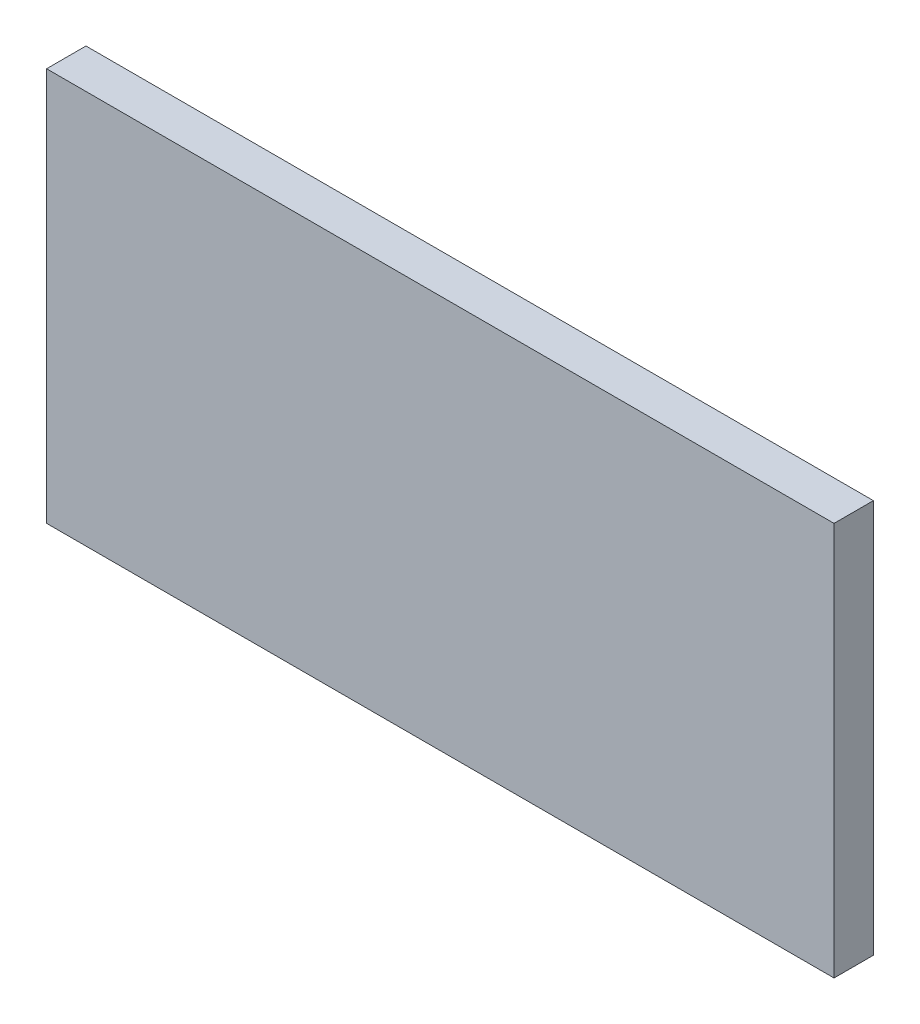
ISO-10303-21;
HEADER;
FILE_DESCRIPTION(('STEP AP214'),'2;1');
FILE_NAME('part.step','',(''),(''),'','','');
FILE_SCHEMA(('AUTOMOTIVE_DESIGN { 1 0 10303 214 1 1 1 1 }'));
ENDSEC;
DATA;
#1=APPLICATION_CONTEXT('core data for automotive mechanical design processes');
#2=APPLICATION_PROTOCOL_DEFINITION('international standard','automotive_design',2000,#1);
#3=PRODUCT_CONTEXT('',#1,'mechanical');
#4=PRODUCT('Part','Part','',(#3));
#5=PRODUCT_RELATED_PRODUCT_CATEGORY('part','',(#4));
#6=PRODUCT_DEFINITION_FORMATION('','',#4);
#7=PRODUCT_DEFINITION_CONTEXT('part definition',#1,'design');
#8=PRODUCT_DEFINITION('design','',#6,#7);
#9=PRODUCT_DEFINITION_SHAPE('','',#8);
#10=(LENGTH_UNIT() NAMED_UNIT(*) SI_UNIT(.MILLI.,.METRE.));
#11=(NAMED_UNIT(*) PLANE_ANGLE_UNIT() SI_UNIT($,.RADIAN.));
#12=(NAMED_UNIT(*) SI_UNIT($,.STERADIAN.) SOLID_ANGLE_UNIT());
#13=UNCERTAINTY_MEASURE_WITH_UNIT(LENGTH_MEASURE(1.E-05),#10,'distance_accuracy_value','');
#14=(GEOMETRIC_REPRESENTATION_CONTEXT(3) GLOBAL_UNCERTAINTY_ASSIGNED_CONTEXT((#13)) GLOBAL_UNIT_ASSIGNED_CONTEXT((#10,
#11,#12)) REPRESENTATION_CONTEXT('',''));
#15=CARTESIAN_POINT('',(0.,0.,0.));
#16=DIRECTION('',(0.,0.,1.));
#17=DIRECTION('',(1.,0.,0.));
#18=AXIS2_PLACEMENT_3D('',#15,#16,#17);
#19=CARTESIAN_POINT('',(0.,0.,2.54));
#20=DIRECTION('',(1.,0.,0.));
#21=DIRECTION('',(0.,0.,-1.));
#22=AXIS2_PLACEMENT_3D('',#19,#20,#21);
#23=PLANE('',#22);
#24=DIRECTION('',(0.,-1.,0.));
#25=VECTOR('',#24,1.);
#26=CARTESIAN_POINT('',(0.,0.,0.));
#27=LINE('',#26,#25);
#28=CARTESIAN_POINT('',(0.,25.4,0.));
#29=VERTEX_POINT('',#28);
#30=CARTESIAN_POINT('',(0.,0.,0.));
#31=VERTEX_POINT('',#30);
#32=EDGE_CURVE('E103',#29,#31,#27,.T.);
#33=ORIENTED_EDGE('',*,*,#32,.T.);
#34=DIRECTION('',(0.,0.,-1.));
#35=VECTOR('',#34,1.);
#36=CARTESIAN_POINT('',(0.,0.,2.54));
#37=LINE('',#36,#35);
#38=CARTESIAN_POINT('',(0.,0.,2.54));
#39=VERTEX_POINT('',#38);
#40=EDGE_CURVE('E11',#39,#31,#37,.T.);
#41=ORIENTED_EDGE('',*,*,#40,.F.);
#42=DIRECTION('',(0.,-1.,0.));
#43=VECTOR('',#42,1.);
#44=CARTESIAN_POINT('',(0.,0.,2.54));
#45=LINE('',#44,#43);
#46=CARTESIAN_POINT('',(0.,25.4,2.54));
#47=VERTEX_POINT('',#46);
#48=EDGE_CURVE('E91',#47,#39,#45,.T.);
#49=ORIENTED_EDGE('',*,*,#48,.F.);
#50=DIRECTION('',(0.,0.,-1.));
#51=VECTOR('',#50,1.);
#52=CARTESIAN_POINT('',(0.,25.4,2.54));
#53=LINE('',#52,#51);
#54=EDGE_CURVE('E99',#47,#29,#53,.T.);
#55=ORIENTED_EDGE('',*,*,#54,.T.);
#56=EDGE_LOOP('',(#33,#41,#49,#55));
#57=FACE_BOUND('',#56,.T.);
#58=ADVANCED_FACE('F39',(#57),#23,.F.);
#59=CARTESIAN_POINT('',(0.,0.,2.54));
#60=DIRECTION('',(0.,1.,0.));
#61=DIRECTION('',(0.,0.,1.));
#62=AXIS2_PLACEMENT_3D('',#59,#60,#61);
#63=PLANE('',#62);
#64=DIRECTION('',(1.,0.,0.));
#65=VECTOR('',#64,1.);
#66=CARTESIAN_POINT('',(0.,0.,0.));
#67=LINE('',#66,#65);
#68=CARTESIAN_POINT('',(50.8,0.,0.));
#69=VERTEX_POINT('',#68);
#70=EDGE_CURVE('E95',#31,#69,#67,.T.);
#71=ORIENTED_EDGE('',*,*,#70,.T.);
#72=DIRECTION('',(0.,0.,-1.));
#73=VECTOR('',#72,1.);
#74=CARTESIAN_POINT('',(50.8,0.,2.54));
#75=LINE('',#74,#73);
#76=CARTESIAN_POINT('',(50.8,0.,2.54));
#77=VERTEX_POINT('',#76);
#78=EDGE_CURVE('E48',#77,#69,#75,.T.);
#79=ORIENTED_EDGE('',*,*,#78,.F.);
#80=DIRECTION('',(1.,0.,0.));
#81=VECTOR('',#80,1.);
#82=CARTESIAN_POINT('',(0.,0.,2.54));
#83=LINE('',#82,#81);
#84=EDGE_CURVE('E86',#39,#77,#83,.T.);
#85=ORIENTED_EDGE('',*,*,#84,.F.);
#86=ORIENTED_EDGE('',*,*,#40,.T.);
#87=EDGE_LOOP('',(#71,#79,#85,#86));
#88=FACE_BOUND('',#87,.T.);
#89=ADVANCED_FACE('F94',(#88),#63,.F.);
#90=CARTESIAN_POINT('',(50.8,0.,2.54));
#91=DIRECTION('',(-1.,0.,0.));
#92=DIRECTION('',(0.,0.,1.));
#93=AXIS2_PLACEMENT_3D('',#90,#91,#92);
#94=PLANE('',#93);
#95=DIRECTION('',(0.,1.,0.));
#96=VECTOR('',#95,1.);
#97=CARTESIAN_POINT('',(50.8,0.,0.));
#98=LINE('',#97,#96);
#99=CARTESIAN_POINT('',(50.8,25.4,0.));
#100=VERTEX_POINT('',#99);
#101=EDGE_CURVE('E73',#69,#100,#98,.T.);
#102=ORIENTED_EDGE('',*,*,#101,.T.);
#103=DIRECTION('',(0.,0.,-1.));
#104=VECTOR('',#103,1.);
#105=CARTESIAN_POINT('',(50.8,25.4,2.54));
#106=LINE('',#105,#104);
#107=CARTESIAN_POINT('',(50.8,25.4,2.54));
#108=VERTEX_POINT('',#107);
#109=EDGE_CURVE('E96',#108,#100,#106,.T.);
#110=ORIENTED_EDGE('',*,*,#109,.F.);
#111=DIRECTION('',(0.,1.,0.));
#112=VECTOR('',#111,1.);
#113=CARTESIAN_POINT('',(50.8,0.,2.54));
#114=LINE('',#113,#112);
#115=EDGE_CURVE('E89',#77,#108,#114,.T.);
#116=ORIENTED_EDGE('',*,*,#115,.F.);
#117=ORIENTED_EDGE('',*,*,#78,.T.);
#118=EDGE_LOOP('',(#102,#110,#116,#117));
#119=FACE_BOUND('',#118,.T.);
#120=ADVANCED_FACE('F97',(#119),#94,.F.);
#121=CARTESIAN_POINT('',(0.,25.4,2.54));
#122=DIRECTION('',(0.,-1.,0.));
#123=DIRECTION('',(0.,0.,-1.));
#124=AXIS2_PLACEMENT_3D('',#121,#122,#123);
#125=PLANE('',#124);
#126=DIRECTION('',(-1.,0.,0.));
#127=VECTOR('',#126,1.);
#128=CARTESIAN_POINT('',(0.,25.4,0.));
#129=LINE('',#128,#127);
#130=EDGE_CURVE('E79',#100,#29,#129,.T.);
#131=ORIENTED_EDGE('',*,*,#130,.T.);
#132=ORIENTED_EDGE('',*,*,#54,.F.);
#133=DIRECTION('',(-1.,0.,0.));
#134=VECTOR('',#133,1.);
#135=CARTESIAN_POINT('',(0.,25.4,2.54));
#136=LINE('',#135,#134);
#137=EDGE_CURVE('E56',#108,#47,#136,.T.);
#138=ORIENTED_EDGE('',*,*,#137,.F.);
#139=ORIENTED_EDGE('',*,*,#109,.T.);
#140=EDGE_LOOP('',(#131,#132,#138,#139));
#141=FACE_BOUND('',#140,.T.);
#142=ADVANCED_FACE('F110',(#141),#125,.F.);
#143=CARTESIAN_POINT('',(0.,25.4,2.54));
#144=DIRECTION('',(0.,0.,-1.));
#145=DIRECTION('',(-1.,0.,0.));
#146=AXIS2_PLACEMENT_3D('',#143,#144,#145);
#147=PLANE('',#146);
#148=ORIENTED_EDGE('',*,*,#48,.T.);
#149=ORIENTED_EDGE('',*,*,#84,.T.);
#150=ORIENTED_EDGE('',*,*,#115,.T.);
#151=ORIENTED_EDGE('',*,*,#137,.T.);
#152=EDGE_LOOP('',(#148,#149,#150,#151));
#153=FACE_BOUND('',#152,.T.);
#154=ADVANCED_FACE('F87',(#153),#147,.F.);
#155=CARTESIAN_POINT('',(0.,25.4,0.));
#156=DIRECTION('',(0.,0.,-1.));
#157=DIRECTION('',(-1.,0.,0.));
#158=AXIS2_PLACEMENT_3D('',#155,#156,#157);
#159=PLANE('',#158);
#160=ORIENTED_EDGE('',*,*,#32,.F.);
#161=ORIENTED_EDGE('',*,*,#130,.F.);
#162=ORIENTED_EDGE('',*,*,#101,.F.);
#163=ORIENTED_EDGE('',*,*,#70,.F.);
#164=EDGE_LOOP('',(#160,#161,#162,#163));
#165=FACE_BOUND('',#164,.T.);
#166=ADVANCED_FACE('F113',(#165),#159,.T.);
#167=CLOSED_SHELL('',(#58,#89,#120,#142,#154,#166));
#168=MANIFOLD_SOLID_BREP('B2',#167);
#169=ADVANCED_BREP_SHAPE_REPRESENTATION('',(#18,#168),#14);
#170=SHAPE_DEFINITION_REPRESENTATION(#9,#169);
ENDSEC;
END-ISO-10303-21;
